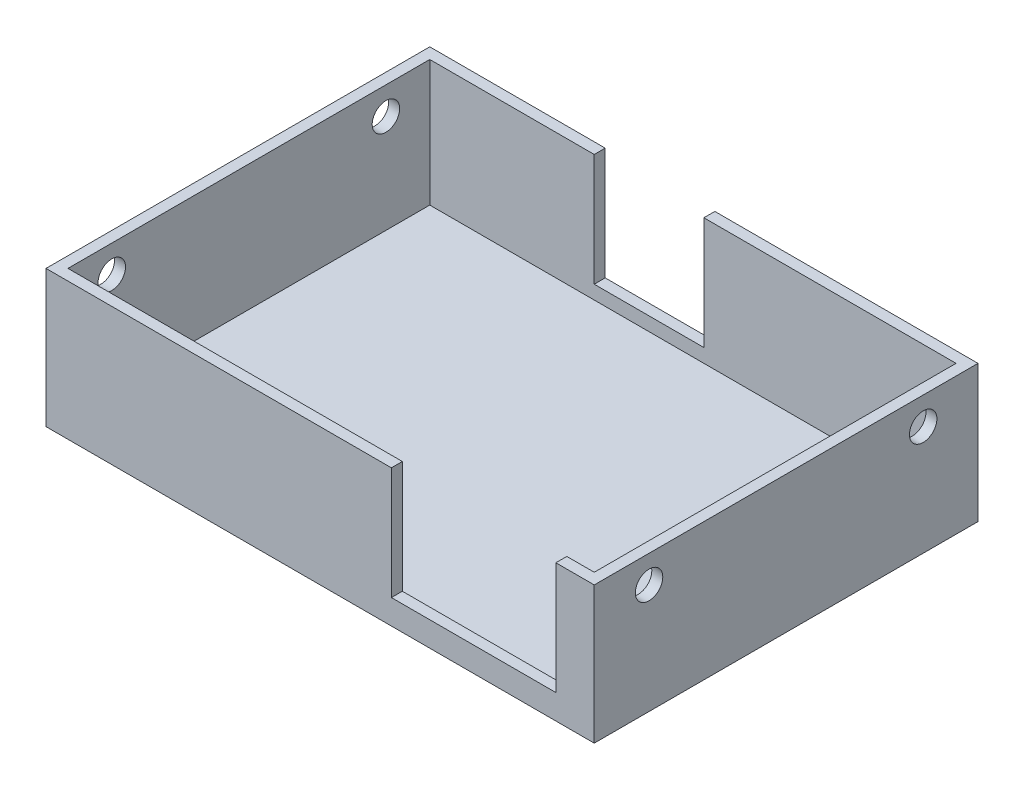
ISO-10303-21;
HEADER;
FILE_DESCRIPTION(('STEP AP214'),'2;1');
FILE_NAME('part.step','',(''),(''),'','','');
FILE_SCHEMA(('AUTOMOTIVE_DESIGN { 1 0 10303 214 1 1 1 1 }'));
ENDSEC;
DATA;
#1=APPLICATION_CONTEXT('core data for automotive mechanical design processes');
#2=APPLICATION_PROTOCOL_DEFINITION('international standard','automotive_design',2000,#1);
#3=PRODUCT_CONTEXT('',#1,'mechanical');
#4=PRODUCT('Part','Part','',(#3));
#5=PRODUCT_RELATED_PRODUCT_CATEGORY('part','',(#4));
#6=PRODUCT_DEFINITION_FORMATION('','',#4);
#7=PRODUCT_DEFINITION_CONTEXT('part definition',#1,'design');
#8=PRODUCT_DEFINITION('design','',#6,#7);
#9=PRODUCT_DEFINITION_SHAPE('','',#8);
#10=(LENGTH_UNIT() NAMED_UNIT(*) SI_UNIT(.MILLI.,.METRE.));
#11=(NAMED_UNIT(*) PLANE_ANGLE_UNIT() SI_UNIT($,.RADIAN.));
#12=(NAMED_UNIT(*) SI_UNIT($,.STERADIAN.) SOLID_ANGLE_UNIT());
#13=UNCERTAINTY_MEASURE_WITH_UNIT(LENGTH_MEASURE(1.E-05),#10,'distance_accuracy_value','');
#14=(GEOMETRIC_REPRESENTATION_CONTEXT(3) GLOBAL_UNCERTAINTY_ASSIGNED_CONTEXT((#13)) GLOBAL_UNIT_ASSIGNED_CONTEXT((#10,
#11,#12)) REPRESENTATION_CONTEXT('',''));
#15=CARTESIAN_POINT('',(0.,0.,0.));
#16=DIRECTION('',(0.,0.,1.));
#17=DIRECTION('',(1.,0.,0.));
#18=AXIS2_PLACEMENT_3D('',#15,#16,#17);
#19=CARTESIAN_POINT('',(0.,31.75,0.));
#20=DIRECTION('',(0.,-1.,0.));
#21=DIRECTION('',(0.,0.,-1.));
#22=AXIS2_PLACEMENT_3D('',#19,#20,#21);
#23=PLANE('',#22);
#24=DIRECTION('',(-1.,0.,0.));
#25=VECTOR('',#24,1.);
#26=CARTESIAN_POINT('',(0.,31.75,-88.9));
#27=LINE('',#26,#25);
#28=CARTESIAN_POINT('',(127.,31.75,-88.9));
#29=VERTEX_POINT('',#28);
#30=CARTESIAN_POINT('',(66.0399999999999,31.75,-88.9));
#31=VERTEX_POINT('',#30);
#32=EDGE_CURVE('E296',#29,#31,#27,.T.);
#33=ORIENTED_EDGE('',*,*,#32,.T.);
#34=DIRECTION('',(0.,0.,-1.));
#35=VECTOR('',#34,1.);
#36=CARTESIAN_POINT('',(66.0399999999999,31.75,-57.15));
#37=LINE('',#36,#35);
#38=CARTESIAN_POINT('',(66.0399999999999,31.75,-86.36));
#39=VERTEX_POINT('',#38);
#40=EDGE_CURVE('E170',#39,#31,#37,.T.);
#41=ORIENTED_EDGE('',*,*,#40,.F.);
#42=DIRECTION('',(-1.,0.,0.));
#43=VECTOR('',#42,1.);
#44=CARTESIAN_POINT('',(0.,31.75,-86.36));
#45=LINE('',#44,#43);
#46=CARTESIAN_POINT('',(124.46,31.75,-86.36));
#47=VERTEX_POINT('',#46);
#48=EDGE_CURVE('E252',#47,#39,#45,.T.);
#49=ORIENTED_EDGE('',*,*,#48,.F.);
#50=DIRECTION('',(0.,0.,-1.));
#51=VECTOR('',#50,1.);
#52=CARTESIAN_POINT('',(124.46,31.75,0.));
#53=LINE('',#52,#51);
#54=CARTESIAN_POINT('',(124.46,31.75,-2.54));
#55=VERTEX_POINT('',#54);
#56=EDGE_CURVE('E274',#55,#47,#53,.T.);
#57=ORIENTED_EDGE('',*,*,#56,.F.);
#58=DIRECTION('',(1.,0.,0.));
#59=VECTOR('',#58,1.);
#60=CARTESIAN_POINT('',(0.,31.75,-2.54));
#61=LINE('',#60,#59);
#62=CARTESIAN_POINT('',(118.11,31.75,-2.54));
#63=VERTEX_POINT('',#62);
#64=EDGE_CURVE('E269',#63,#55,#61,.T.);
#65=ORIENTED_EDGE('',*,*,#64,.F.);
#66=DIRECTION('',(0.,0.,1.));
#67=VECTOR('',#66,1.);
#68=CARTESIAN_POINT('',(118.11,31.75,-31.75));
#69=LINE('',#68,#67);
#70=CARTESIAN_POINT('',(118.11,31.75,0.));
#71=VERTEX_POINT('',#70);
#72=EDGE_CURVE('E209',#63,#71,#69,.T.);
#73=ORIENTED_EDGE('',*,*,#72,.T.);
#74=DIRECTION('',(1.,0.,0.));
#75=VECTOR('',#74,1.);
#76=CARTESIAN_POINT('',(0.,31.75,0.));
#77=LINE('',#76,#75);
#78=CARTESIAN_POINT('',(127.,31.75,0.));
#79=VERTEX_POINT('',#78);
#80=EDGE_CURVE('E286',#71,#79,#77,.T.);
#81=ORIENTED_EDGE('',*,*,#80,.T.);
#82=DIRECTION('',(0.,0.,-1.));
#83=VECTOR('',#82,1.);
#84=CARTESIAN_POINT('',(127.,31.75,0.));
#85=LINE('',#84,#83);
#86=EDGE_CURVE('E292',#79,#29,#85,.T.);
#87=ORIENTED_EDGE('',*,*,#86,.T.);
#88=EDGE_LOOP('',(#33,#41,#49,#57,#65,#73,#81,#87));
#89=FACE_BOUND('',#88,.T.);
#90=ADVANCED_FACE('F42',(#89),#23,.F.);
#91=CARTESIAN_POINT('',(40.6399999999999,31.75,-86.36));
#92=VERTEX_POINT('',#91);
#93=CARTESIAN_POINT('',(2.53999999999995,31.75,-86.36));
#94=VERTEX_POINT('',#93);
#95=EDGE_CURVE('E278',#92,#94,#45,.T.);
#96=ORIENTED_EDGE('',*,*,#95,.F.);
#97=DIRECTION('',(0.,0.,-1.));
#98=VECTOR('',#97,1.);
#99=CARTESIAN_POINT('',(40.6399999999999,31.75,-57.15));
#100=LINE('',#99,#98);
#101=CARTESIAN_POINT('',(40.6399999999999,31.75,-88.9));
#102=VERTEX_POINT('',#101);
#103=EDGE_CURVE('E189',#92,#102,#100,.T.);
#104=ORIENTED_EDGE('',*,*,#103,.T.);
#105=CARTESIAN_POINT('',(0.,31.75,-88.9));
#106=VERTEX_POINT('',#105);
#107=EDGE_CURVE('E295',#102,#106,#27,.T.);
#108=ORIENTED_EDGE('',*,*,#107,.T.);
#109=DIRECTION('',(0.,0.,1.));
#110=VECTOR('',#109,1.);
#111=CARTESIAN_POINT('',(0.,31.75,0.));
#112=LINE('',#111,#110);
#113=CARTESIAN_POINT('',(0.,31.75,0.));
#114=VERTEX_POINT('',#113);
#115=EDGE_CURVE('E282',#106,#114,#112,.T.);
#116=ORIENTED_EDGE('',*,*,#115,.T.);
#117=CARTESIAN_POINT('',(80.01,31.75,0.));
#118=VERTEX_POINT('',#117);
#119=EDGE_CURVE('E288',#114,#118,#77,.T.);
#120=ORIENTED_EDGE('',*,*,#119,.T.);
#121=DIRECTION('',(0.,0.,1.));
#122=VECTOR('',#121,1.);
#123=CARTESIAN_POINT('',(80.01,31.75,-31.75));
#124=LINE('',#123,#122);
#125=CARTESIAN_POINT('',(80.01,31.75,-2.54));
#126=VERTEX_POINT('',#125);
#127=EDGE_CURVE('E205',#126,#118,#124,.T.);
#128=ORIENTED_EDGE('',*,*,#127,.F.);
#129=CARTESIAN_POINT('',(2.54,31.75,-2.54));
#130=VERTEX_POINT('',#129);
#131=EDGE_CURVE('E270',#130,#126,#61,.T.);
#132=ORIENTED_EDGE('',*,*,#131,.F.);
#133=DIRECTION('',(0.,0.,1.));
#134=VECTOR('',#133,1.);
#135=CARTESIAN_POINT('',(2.54,31.75,0.));
#136=LINE('',#135,#134);
#137=EDGE_CURVE('E266',#94,#130,#136,.T.);
#138=ORIENTED_EDGE('',*,*,#137,.F.);
#139=EDGE_LOOP('',(#96,#104,#108,#116,#120,#128,#132,#138));
#140=FACE_BOUND('',#139,.T.);
#141=ADVANCED_FACE('F434',(#140),#23,.F.);
#142=CARTESIAN_POINT('',(0.,31.75,0.));
#143=DIRECTION('',(1.,0.,0.));
#144=DIRECTION('',(0.,0.,-1.));
#145=AXIS2_PLACEMENT_3D('',#142,#143,#144);
#146=PLANE('',#145);
#147=CARTESIAN_POINT('',(0.,25.4,-12.6999999999999));
#148=DIRECTION('',(1.,0.,0.));
#149=DIRECTION('',(0.,0.,-1.));
#150=AXIS2_PLACEMENT_3D('',#147,#148,#149);
#151=CIRCLE('',#150,3.175);
#152=CARTESIAN_POINT('',(0.,25.4,-15.8749999999999));
#153=VERTEX_POINT('',#152);
#154=EDGE_CURVE('E217',#153,#153,#151,.T.);
#155=ORIENTED_EDGE('',*,*,#154,.T.);
#156=EDGE_LOOP('',(#155));
#157=FACE_BOUND('',#156,.T.);
#158=CARTESIAN_POINT('',(0.,25.4,-76.1999999999999));
#159=DIRECTION('',(1.,0.,0.));
#160=DIRECTION('',(0.,0.,-1.));
#161=AXIS2_PLACEMENT_3D('',#158,#159,#160);
#162=CIRCLE('',#161,3.175);
#163=CARTESIAN_POINT('',(0.,25.4,-79.3749999999999));
#164=VERTEX_POINT('',#163);
#165=EDGE_CURVE('E208',#164,#164,#162,.T.);
#166=ORIENTED_EDGE('',*,*,#165,.T.);
#167=EDGE_LOOP('',(#166));
#168=FACE_BOUND('',#167,.T.);
#169=DIRECTION('',(0.,0.,1.));
#170=VECTOR('',#169,1.);
#171=CARTESIAN_POINT('',(0.,0.,0.));
#172=LINE('',#171,#170);
#173=CARTESIAN_POINT('',(0.,0.,-88.9));
#174=VERTEX_POINT('',#173);
#175=CARTESIAN_POINT('',(0.,0.,0.));
#176=VERTEX_POINT('',#175);
#177=EDGE_CURVE('E245',#174,#176,#172,.T.);
#178=ORIENTED_EDGE('',*,*,#177,.T.);
#179=DIRECTION('',(0.,-1.,0.));
#180=VECTOR('',#179,1.);
#181=CARTESIAN_POINT('',(0.,31.75,0.));
#182=LINE('',#181,#180);
#183=EDGE_CURVE('E322',#114,#176,#182,.T.);
#184=ORIENTED_EDGE('',*,*,#183,.F.);
#185=ORIENTED_EDGE('',*,*,#115,.F.);
#186=DIRECTION('',(0.,-1.,0.));
#187=VECTOR('',#186,1.);
#188=CARTESIAN_POINT('',(0.,31.75,-88.9));
#189=LINE('',#188,#187);
#190=EDGE_CURVE('E299',#106,#174,#189,.T.);
#191=ORIENTED_EDGE('',*,*,#190,.T.);
#192=EDGE_LOOP('',(#178,#184,#185,#191));
#193=FACE_BOUND('',#192,.T.);
#194=ADVANCED_FACE('F44',(#157,#168,#193),#146,.F.);
#195=CARTESIAN_POINT('',(0.,31.75,0.));
#196=DIRECTION('',(0.,0.,-1.));
#197=DIRECTION('',(-1.,0.,0.));
#198=AXIS2_PLACEMENT_3D('',#195,#196,#197);
#199=PLANE('',#198);
#200=DIRECTION('',(1.,0.,0.));
#201=VECTOR('',#200,1.);
#202=CARTESIAN_POINT('',(80.01,5.715,0.));
#203=LINE('',#202,#201);
#204=CARTESIAN_POINT('',(80.01,5.715,0.));
#205=VERTEX_POINT('',#204);
#206=CARTESIAN_POINT('',(118.11,5.715,0.));
#207=VERTEX_POINT('',#206);
#208=EDGE_CURVE('E198',#205,#207,#203,.T.);
#209=ORIENTED_EDGE('',*,*,#208,.F.);
#210=DIRECTION('',(0.,-1.,0.));
#211=VECTOR('',#210,1.);
#212=CARTESIAN_POINT('',(80.01,31.75,0.));
#213=LINE('',#212,#211);
#214=EDGE_CURVE('E188',#118,#205,#213,.T.);
#215=ORIENTED_EDGE('',*,*,#214,.F.);
#216=ORIENTED_EDGE('',*,*,#119,.F.);
#217=ORIENTED_EDGE('',*,*,#183,.T.);
#218=DIRECTION('',(1.,0.,0.));
#219=VECTOR('',#218,1.);
#220=CARTESIAN_POINT('',(0.,0.,0.));
#221=LINE('',#220,#219);
#222=CARTESIAN_POINT('',(127.,0.,0.));
#223=VERTEX_POINT('',#222);
#224=EDGE_CURVE('E303',#176,#223,#221,.T.);
#225=ORIENTED_EDGE('',*,*,#224,.T.);
#226=DIRECTION('',(0.,-1.,0.));
#227=VECTOR('',#226,1.);
#228=CARTESIAN_POINT('',(127.,31.75,0.));
#229=LINE('',#228,#227);
#230=EDGE_CURVE('E318',#79,#223,#229,.T.);
#231=ORIENTED_EDGE('',*,*,#230,.F.);
#232=ORIENTED_EDGE('',*,*,#80,.F.);
#233=DIRECTION('',(0.,1.,0.));
#234=VECTOR('',#233,1.);
#235=CARTESIAN_POINT('',(118.11,31.75,0.));
#236=LINE('',#235,#234);
#237=EDGE_CURVE('E201',#207,#71,#236,.T.);
#238=ORIENTED_EDGE('',*,*,#237,.F.);
#239=EDGE_LOOP('',(#209,#215,#216,#217,#225,#231,#232,#238));
#240=FACE_BOUND('',#239,.T.);
#241=ADVANCED_FACE('F454',(#240),#199,.F.);
#242=CARTESIAN_POINT('',(127.,31.75,0.));
#243=DIRECTION('',(-1.,0.,0.));
#244=DIRECTION('',(0.,0.,1.));
#245=AXIS2_PLACEMENT_3D('',#242,#243,#244);
#246=PLANE('',#245);
#247=CARTESIAN_POINT('',(127.,25.4,-12.7));
#248=DIRECTION('',(1.,0.,0.));
#249=DIRECTION('',(0.,0.,-1.));
#250=AXIS2_PLACEMENT_3D('',#247,#248,#249);
#251=CIRCLE('',#250,3.175);
#252=CARTESIAN_POINT('',(127.,25.4,-15.875));
#253=VERTEX_POINT('',#252);
#254=EDGE_CURVE('E225',#253,#253,#251,.T.);
#255=ORIENTED_EDGE('',*,*,#254,.F.);
#256=EDGE_LOOP('',(#255));
#257=FACE_BOUND('',#256,.T.);
#258=CARTESIAN_POINT('',(127.,25.4,-76.2));
#259=DIRECTION('',(1.,0.,0.));
#260=DIRECTION('',(0.,0.,-1.));
#261=AXIS2_PLACEMENT_3D('',#258,#259,#260);
#262=CIRCLE('',#261,3.175);
#263=CARTESIAN_POINT('',(127.,25.4,-79.375));
#264=VERTEX_POINT('',#263);
#265=EDGE_CURVE('E230',#264,#264,#262,.T.);
#266=ORIENTED_EDGE('',*,*,#265,.F.);
#267=EDGE_LOOP('',(#266));
#268=FACE_BOUND('',#267,.T.);
#269=DIRECTION('',(0.,0.,-1.));
#270=VECTOR('',#269,1.);
#271=CARTESIAN_POINT('',(127.,0.,0.));
#272=LINE('',#271,#270);
#273=CARTESIAN_POINT('',(127.,0.,-88.9));
#274=VERTEX_POINT('',#273);
#275=EDGE_CURVE('E306',#223,#274,#272,.T.);
#276=ORIENTED_EDGE('',*,*,#275,.T.);
#277=DIRECTION('',(0.,-1.,0.));
#278=VECTOR('',#277,1.);
#279=CARTESIAN_POINT('',(127.,31.75,-88.9));
#280=LINE('',#279,#278);
#281=EDGE_CURVE('E314',#29,#274,#280,.T.);
#282=ORIENTED_EDGE('',*,*,#281,.F.);
#283=ORIENTED_EDGE('',*,*,#86,.F.);
#284=ORIENTED_EDGE('',*,*,#230,.T.);
#285=EDGE_LOOP('',(#276,#282,#283,#284));
#286=FACE_BOUND('',#285,.T.);
#287=ADVANCED_FACE('F460',(#257,#268,#286),#246,.F.);
#288=CARTESIAN_POINT('',(0.,31.75,-88.9));
#289=DIRECTION('',(0.,0.,1.));
#290=DIRECTION('',(1.,0.,0.));
#291=AXIS2_PLACEMENT_3D('',#288,#289,#290);
#292=PLANE('',#291);
#293=DIRECTION('',(-1.,0.,0.));
#294=VECTOR('',#293,1.);
#295=CARTESIAN_POINT('',(66.0399999999999,5.715,-88.9));
#296=LINE('',#295,#294);
#297=CARTESIAN_POINT('',(66.0399999999999,5.715,-88.9));
#298=VERTEX_POINT('',#297);
#299=CARTESIAN_POINT('',(40.6399999999999,5.715,-88.9));
#300=VERTEX_POINT('',#299);
#301=EDGE_CURVE('E157',#298,#300,#296,.T.);
#302=ORIENTED_EDGE('',*,*,#301,.F.);
#303=DIRECTION('',(0.,-1.,0.));
#304=VECTOR('',#303,1.);
#305=CARTESIAN_POINT('',(66.0399999999999,31.75,-88.9));
#306=LINE('',#305,#304);
#307=EDGE_CURVE('E167',#31,#298,#306,.T.);
#308=ORIENTED_EDGE('',*,*,#307,.F.);
#309=ORIENTED_EDGE('',*,*,#32,.F.);
#310=ORIENTED_EDGE('',*,*,#281,.T.);
#311=DIRECTION('',(-1.,0.,0.));
#312=VECTOR('',#311,1.);
#313=CARTESIAN_POINT('',(0.,0.,-88.9));
#314=LINE('',#313,#312);
#315=EDGE_CURVE('E287',#274,#174,#314,.T.);
#316=ORIENTED_EDGE('',*,*,#315,.T.);
#317=ORIENTED_EDGE('',*,*,#190,.F.);
#318=ORIENTED_EDGE('',*,*,#107,.F.);
#319=DIRECTION('',(0.,1.,0.));
#320=VECTOR('',#319,1.);
#321=CARTESIAN_POINT('',(40.6399999999999,31.75,-88.9));
#322=LINE('',#321,#320);
#323=EDGE_CURVE('E164',#300,#102,#322,.T.);
#324=ORIENTED_EDGE('',*,*,#323,.F.);
#325=EDGE_LOOP('',(#302,#308,#309,#310,#316,#317,#318,#324));
#326=FACE_BOUND('',#325,.T.);
#327=ADVANCED_FACE('F176',(#326),#292,.F.);
#328=CARTESIAN_POINT('',(0.,0.,0.));
#329=DIRECTION('',(0.,-1.,0.));
#330=DIRECTION('',(0.,0.,-1.));
#331=AXIS2_PLACEMENT_3D('',#328,#329,#330);
#332=PLANE('',#331);
#333=ORIENTED_EDGE('',*,*,#177,.F.);
#334=ORIENTED_EDGE('',*,*,#315,.F.);
#335=ORIENTED_EDGE('',*,*,#275,.F.);
#336=ORIENTED_EDGE('',*,*,#224,.F.);
#337=EDGE_LOOP('',(#333,#334,#335,#336));
#338=FACE_BOUND('',#337,.T.);
#339=ADVANCED_FACE('F367',(#338),#332,.T.);
#340=CARTESIAN_POINT('',(2.54,31.75,0.));
#341=DIRECTION('',(1.,0.,0.));
#342=DIRECTION('',(0.,0.,-1.));
#343=AXIS2_PLACEMENT_3D('',#340,#341,#342);
#344=PLANE('',#343);
#345=CARTESIAN_POINT('',(2.53999999999999,25.4,-12.6999999999999));
#346=DIRECTION('',(1.,0.,0.));
#347=DIRECTION('',(0.,0.,-1.));
#348=AXIS2_PLACEMENT_3D('',#345,#346,#347);
#349=CIRCLE('',#348,3.175);
#350=CARTESIAN_POINT('',(2.53999999999999,25.4,-15.8749999999999));
#351=VERTEX_POINT('',#350);
#352=EDGE_CURVE('E234',#351,#351,#349,.F.);
#353=ORIENTED_EDGE('',*,*,#352,.T.);
#354=EDGE_LOOP('',(#353));
#355=FACE_BOUND('',#354,.T.);
#356=CARTESIAN_POINT('',(2.53999999999995,25.4,-76.1999999999999));
#357=DIRECTION('',(1.,0.,0.));
#358=DIRECTION('',(0.,0.,-1.));
#359=AXIS2_PLACEMENT_3D('',#356,#357,#358);
#360=CIRCLE('',#359,3.175);
#361=CARTESIAN_POINT('',(2.53999999999995,25.4,-79.3749999999999));
#362=VERTEX_POINT('',#361);
#363=EDGE_CURVE('E221',#362,#362,#360,.F.);
#364=ORIENTED_EDGE('',*,*,#363,.T.);
#365=EDGE_LOOP('',(#364));
#366=FACE_BOUND('',#365,.T.);
#367=DIRECTION('',(0.,0.,1.));
#368=VECTOR('',#367,1.);
#369=CARTESIAN_POINT('',(2.54,2.54,0.));
#370=LINE('',#369,#368);
#371=CARTESIAN_POINT('',(2.53999999999995,2.54,-86.36));
#372=VERTEX_POINT('',#371);
#373=CARTESIAN_POINT('',(2.54,2.54,-2.54));
#374=VERTEX_POINT('',#373);
#375=EDGE_CURVE('E235',#372,#374,#370,.T.);
#376=ORIENTED_EDGE('',*,*,#375,.F.);
#377=DIRECTION('',(0.,-1.,0.));
#378=VECTOR('',#377,1.);
#379=CARTESIAN_POINT('',(2.53999999999995,31.75,-86.36));
#380=LINE('',#379,#378);
#381=EDGE_CURVE('E247',#94,#372,#380,.T.);
#382=ORIENTED_EDGE('',*,*,#381,.F.);
#383=ORIENTED_EDGE('',*,*,#137,.T.);
#384=DIRECTION('',(0.,-1.,0.));
#385=VECTOR('',#384,1.);
#386=CARTESIAN_POINT('',(2.54,31.75,-2.54));
#387=LINE('',#386,#385);
#388=EDGE_CURVE('E241',#130,#374,#387,.T.);
#389=ORIENTED_EDGE('',*,*,#388,.T.);
#390=EDGE_LOOP('',(#376,#382,#383,#389));
#391=FACE_BOUND('',#390,.T.);
#392=ADVANCED_FACE('F431',(#355,#366,#391),#344,.T.);
#393=CARTESIAN_POINT('',(0.,31.75,-2.54));
#394=DIRECTION('',(0.,0.,-1.));
#395=DIRECTION('',(-1.,0.,0.));
#396=AXIS2_PLACEMENT_3D('',#393,#394,#395);
#397=PLANE('',#396);
#398=DIRECTION('',(0.,1.,0.));
#399=VECTOR('',#398,1.);
#400=CARTESIAN_POINT('',(80.01,31.75,-2.54));
#401=LINE('',#400,#399);
#402=CARTESIAN_POINT('',(80.01,5.715,-2.54));
#403=VERTEX_POINT('',#402);
#404=EDGE_CURVE('E344',#403,#126,#401,.T.);
#405=ORIENTED_EDGE('',*,*,#404,.F.);
#406=DIRECTION('',(-1.,0.,0.));
#407=VECTOR('',#406,1.);
#408=CARTESIAN_POINT('',(0.,5.71499999999999,-2.54));
#409=LINE('',#408,#407);
#410=CARTESIAN_POINT('',(118.11,5.715,-2.54));
#411=VERTEX_POINT('',#410);
#412=EDGE_CURVE('E326',#411,#403,#409,.T.);
#413=ORIENTED_EDGE('',*,*,#412,.F.);
#414=DIRECTION('',(0.,-1.,0.));
#415=VECTOR('',#414,1.);
#416=CARTESIAN_POINT('',(118.11,31.75,-2.54));
#417=LINE('',#416,#415);
#418=EDGE_CURVE('E341',#63,#411,#417,.T.);
#419=ORIENTED_EDGE('',*,*,#418,.F.);
#420=ORIENTED_EDGE('',*,*,#64,.T.);
#421=DIRECTION('',(0.,-1.,0.));
#422=VECTOR('',#421,1.);
#423=CARTESIAN_POINT('',(124.46,31.75,-2.54));
#424=LINE('',#423,#422);
#425=CARTESIAN_POINT('',(124.46,2.54,-2.54));
#426=VERTEX_POINT('',#425);
#427=EDGE_CURVE('E246',#55,#426,#424,.T.);
#428=ORIENTED_EDGE('',*,*,#427,.T.);
#429=DIRECTION('',(1.,0.,0.));
#430=VECTOR('',#429,1.);
#431=CARTESIAN_POINT('',(0.,2.54,-2.54));
#432=LINE('',#431,#430);
#433=EDGE_CURVE('E239',#374,#426,#432,.T.);
#434=ORIENTED_EDGE('',*,*,#433,.F.);
#435=ORIENTED_EDGE('',*,*,#388,.F.);
#436=ORIENTED_EDGE('',*,*,#131,.T.);
#437=EDGE_LOOP('',(#405,#413,#419,#420,#428,#434,#435,#436));
#438=FACE_BOUND('',#437,.T.);
#439=ADVANCED_FACE('F438',(#438),#397,.T.);
#440=CARTESIAN_POINT('',(124.46,31.75,0.));
#441=DIRECTION('',(-1.,0.,0.));
#442=DIRECTION('',(0.,0.,1.));
#443=AXIS2_PLACEMENT_3D('',#440,#441,#442);
#444=PLANE('',#443);
#445=CARTESIAN_POINT('',(124.46,25.4,-12.7));
#446=DIRECTION('',(-1.,0.,0.));
#447=DIRECTION('',(0.,0.,1.));
#448=AXIS2_PLACEMENT_3D('',#445,#446,#447);
#449=CIRCLE('',#448,3.175);
#450=CARTESIAN_POINT('',(124.46,25.4,-9.525));
#451=VERTEX_POINT('',#450);
#452=EDGE_CURVE('E240',#451,#451,#449,.T.);
#453=ORIENTED_EDGE('',*,*,#452,.F.);
#454=EDGE_LOOP('',(#453));
#455=FACE_BOUND('',#454,.T.);
#456=CARTESIAN_POINT('',(124.46,25.4,-76.2));
#457=DIRECTION('',(-1.,0.,0.));
#458=DIRECTION('',(0.,0.,1.));
#459=AXIS2_PLACEMENT_3D('',#456,#457,#458);
#460=CIRCLE('',#459,3.175);
#461=CARTESIAN_POINT('',(124.46,25.4,-73.025));
#462=VERTEX_POINT('',#461);
#463=EDGE_CURVE('E229',#462,#462,#460,.T.);
#464=ORIENTED_EDGE('',*,*,#463,.F.);
#465=EDGE_LOOP('',(#464));
#466=FACE_BOUND('',#465,.T.);
#467=DIRECTION('',(0.,0.,-1.));
#468=VECTOR('',#467,1.);
#469=CARTESIAN_POINT('',(124.46,2.54,0.));
#470=LINE('',#469,#468);
#471=CARTESIAN_POINT('',(124.46,2.54,-86.36));
#472=VERTEX_POINT('',#471);
#473=EDGE_CURVE('E254',#426,#472,#470,.T.);
#474=ORIENTED_EDGE('',*,*,#473,.F.);
#475=ORIENTED_EDGE('',*,*,#427,.F.);
#476=ORIENTED_EDGE('',*,*,#56,.T.);
#477=DIRECTION('',(0.,-1.,0.));
#478=VECTOR('',#477,1.);
#479=CARTESIAN_POINT('',(124.46,31.75,-86.36));
#480=LINE('',#479,#478);
#481=EDGE_CURVE('E251',#47,#472,#480,.T.);
#482=ORIENTED_EDGE('',*,*,#481,.T.);
#483=EDGE_LOOP('',(#474,#475,#476,#482));
#484=FACE_BOUND('',#483,.T.);
#485=ADVANCED_FACE('F445',(#455,#466,#484),#444,.T.);
#486=CARTESIAN_POINT('',(0.,31.75,-86.36));
#487=DIRECTION('',(0.,0.,1.));
#488=DIRECTION('',(1.,0.,0.));
#489=AXIS2_PLACEMENT_3D('',#486,#487,#488);
#490=PLANE('',#489);
#491=DIRECTION('',(0.,1.,0.));
#492=VECTOR('',#491,1.);
#493=CARTESIAN_POINT('',(66.0399999999999,31.75,-86.36));
#494=LINE('',#493,#492);
#495=CARTESIAN_POINT('',(66.0399999999999,5.715,-86.36));
#496=VERTEX_POINT('',#495);
#497=EDGE_CURVE('E11',#496,#39,#494,.T.);
#498=ORIENTED_EDGE('',*,*,#497,.F.);
#499=DIRECTION('',(1.,0.,0.));
#500=VECTOR('',#499,1.);
#501=CARTESIAN_POINT('',(0.,5.715,-86.36));
#502=LINE('',#501,#500);
#503=CARTESIAN_POINT('',(40.6399999999999,5.715,-86.36));
#504=VERTEX_POINT('',#503);
#505=EDGE_CURVE('E160',#504,#496,#502,.T.);
#506=ORIENTED_EDGE('',*,*,#505,.F.);
#507=DIRECTION('',(0.,-1.,0.));
#508=VECTOR('',#507,1.);
#509=CARTESIAN_POINT('',(40.6399999999999,31.75,-86.36));
#510=LINE('',#509,#508);
#511=EDGE_CURVE('E51',#92,#504,#510,.T.);
#512=ORIENTED_EDGE('',*,*,#511,.F.);
#513=ORIENTED_EDGE('',*,*,#95,.T.);
#514=ORIENTED_EDGE('',*,*,#381,.T.);
#515=DIRECTION('',(-1.,0.,0.));
#516=VECTOR('',#515,1.);
#517=CARTESIAN_POINT('',(0.,2.54,-86.36));
#518=LINE('',#517,#516);
#519=EDGE_CURVE('E260',#472,#372,#518,.T.);
#520=ORIENTED_EDGE('',*,*,#519,.F.);
#521=ORIENTED_EDGE('',*,*,#481,.F.);
#522=ORIENTED_EDGE('',*,*,#48,.T.);
#523=EDGE_LOOP('',(#498,#506,#512,#513,#514,#520,#521,#522));
#524=FACE_BOUND('',#523,.T.);
#525=ADVANCED_FACE('F355',(#524),#490,.T.);
#526=CARTESIAN_POINT('',(0.,2.54,0.));
#527=DIRECTION('',(0.,-1.,0.));
#528=DIRECTION('',(0.,0.,-1.));
#529=AXIS2_PLACEMENT_3D('',#526,#527,#528);
#530=PLANE('',#529);
#531=ORIENTED_EDGE('',*,*,#375,.T.);
#532=ORIENTED_EDGE('',*,*,#433,.T.);
#533=ORIENTED_EDGE('',*,*,#473,.T.);
#534=ORIENTED_EDGE('',*,*,#519,.T.);
#535=EDGE_LOOP('',(#531,#532,#533,#534));
#536=FACE_BOUND('',#535,.T.);
#537=ADVANCED_FACE('F441',(#536),#530,.F.);
#538=CARTESIAN_POINT('',(95.2499999999999,25.4,-76.2));
#539=DIRECTION('',(1.,0.,0.));
#540=DIRECTION('',(0.,0.,-1.));
#541=AXIS2_PLACEMENT_3D('',#538,#539,#540);
#542=CYLINDRICAL_SURFACE('',#541,3.175);
#543=ORIENTED_EDGE('',*,*,#463,.T.);
#544=EDGE_LOOP('',(#543));
#545=FACE_BOUND('',#544,.T.);
#546=ORIENTED_EDGE('',*,*,#265,.T.);
#547=EDGE_LOOP('',(#546));
#548=FACE_BOUND('',#547,.T.);
#549=ADVANCED_FACE('F491',(#545,#548),#542,.F.);
#550=CARTESIAN_POINT('',(95.25,25.4,-12.7));
#551=DIRECTION('',(1.,0.,0.));
#552=DIRECTION('',(0.,0.,-1.));
#553=AXIS2_PLACEMENT_3D('',#550,#551,#552);
#554=CYLINDRICAL_SURFACE('',#553,3.175);
#555=ORIENTED_EDGE('',*,*,#452,.T.);
#556=EDGE_LOOP('',(#555));
#557=FACE_BOUND('',#556,.T.);
#558=ORIENTED_EDGE('',*,*,#254,.T.);
#559=EDGE_LOOP('',(#558));
#560=FACE_BOUND('',#559,.T.);
#561=ADVANCED_FACE('F503',(#557,#560),#554,.F.);
#562=CARTESIAN_POINT('',(31.75,25.4,-76.1999999999999));
#563=DIRECTION('',(-1.,0.,0.));
#564=DIRECTION('',(0.,0.,1.));
#565=AXIS2_PLACEMENT_3D('',#562,#563,#564);
#566=CYLINDRICAL_SURFACE('',#565,3.175);
#567=ORIENTED_EDGE('',*,*,#363,.F.);
#568=EDGE_LOOP('',(#567));
#569=FACE_BOUND('',#568,.T.);
#570=ORIENTED_EDGE('',*,*,#165,.F.);
#571=EDGE_LOOP('',(#570));
#572=FACE_BOUND('',#571,.T.);
#573=ADVANCED_FACE('F508',(#569,#572),#566,.F.);
#574=CARTESIAN_POINT('',(31.75,25.4,-12.6999999999999));
#575=DIRECTION('',(-1.,0.,0.));
#576=DIRECTION('',(0.,0.,1.));
#577=AXIS2_PLACEMENT_3D('',#574,#575,#576);
#578=CYLINDRICAL_SURFACE('',#577,3.175);
#579=ORIENTED_EDGE('',*,*,#352,.F.);
#580=EDGE_LOOP('',(#579));
#581=FACE_BOUND('',#580,.T.);
#582=ORIENTED_EDGE('',*,*,#154,.F.);
#583=EDGE_LOOP('',(#582));
#584=FACE_BOUND('',#583,.T.);
#585=ADVANCED_FACE('F517',(#581,#584),#578,.F.);
#586=CARTESIAN_POINT('',(80.01,31.75,-31.75));
#587=DIRECTION('',(-1.,0.,0.));
#588=DIRECTION('',(0.,0.,1.));
#589=AXIS2_PLACEMENT_3D('',#586,#587,#588);
#590=PLANE('',#589);
#591=ORIENTED_EDGE('',*,*,#404,.T.);
#592=ORIENTED_EDGE('',*,*,#127,.T.);
#593=ORIENTED_EDGE('',*,*,#214,.T.);
#594=DIRECTION('',(0.,0.,1.));
#595=VECTOR('',#594,1.);
#596=CARTESIAN_POINT('',(80.01,5.715,-31.75));
#597=LINE('',#596,#595);
#598=EDGE_CURVE('E204',#403,#205,#597,.T.);
#599=ORIENTED_EDGE('',*,*,#598,.F.);
#600=EDGE_LOOP('',(#591,#592,#593,#599));
#601=FACE_BOUND('',#600,.T.);
#602=ADVANCED_FACE('F524',(#601),#590,.F.);
#603=CARTESIAN_POINT('',(118.11,31.75,-31.75));
#604=DIRECTION('',(1.,0.,0.));
#605=DIRECTION('',(0.,0.,-1.));
#606=AXIS2_PLACEMENT_3D('',#603,#604,#605);
#607=PLANE('',#606);
#608=ORIENTED_EDGE('',*,*,#418,.T.);
#609=DIRECTION('',(0.,0.,1.));
#610=VECTOR('',#609,1.);
#611=CARTESIAN_POINT('',(118.11,5.715,-31.75));
#612=LINE('',#611,#610);
#613=EDGE_CURVE('E66',#411,#207,#612,.T.);
#614=ORIENTED_EDGE('',*,*,#613,.T.);
#615=ORIENTED_EDGE('',*,*,#237,.T.);
#616=ORIENTED_EDGE('',*,*,#72,.F.);
#617=EDGE_LOOP('',(#608,#614,#615,#616));
#618=FACE_BOUND('',#617,.T.);
#619=ADVANCED_FACE('F450',(#618),#607,.F.);
#620=CARTESIAN_POINT('',(80.01,5.715,-31.75));
#621=DIRECTION('',(0.,-1.,0.));
#622=DIRECTION('',(1.,0.,0.));
#623=AXIS2_PLACEMENT_3D('',#620,#621,#622);
#624=PLANE('',#623);
#625=ORIENTED_EDGE('',*,*,#412,.T.);
#626=ORIENTED_EDGE('',*,*,#598,.T.);
#627=ORIENTED_EDGE('',*,*,#208,.T.);
#628=ORIENTED_EDGE('',*,*,#613,.F.);
#629=EDGE_LOOP('',(#625,#626,#627,#628));
#630=FACE_BOUND('',#629,.T.);
#631=ADVANCED_FACE('F529',(#630),#624,.F.);
#632=CARTESIAN_POINT('',(66.0399999999999,31.75,-57.15));
#633=DIRECTION('',(1.,0.,0.));
#634=DIRECTION('',(0.,0.,-1.));
#635=AXIS2_PLACEMENT_3D('',#632,#633,#634);
#636=PLANE('',#635);
#637=ORIENTED_EDGE('',*,*,#497,.T.);
#638=ORIENTED_EDGE('',*,*,#40,.T.);
#639=ORIENTED_EDGE('',*,*,#307,.T.);
#640=DIRECTION('',(0.,0.,-1.));
#641=VECTOR('',#640,1.);
#642=CARTESIAN_POINT('',(66.0399999999999,5.715,-57.15));
#643=LINE('',#642,#641);
#644=EDGE_CURVE('E153',#496,#298,#643,.T.);
#645=ORIENTED_EDGE('',*,*,#644,.F.);
#646=EDGE_LOOP('',(#637,#638,#639,#645));
#647=FACE_BOUND('',#646,.T.);
#648=ADVANCED_FACE('F168',(#647),#636,.F.);
#649=CARTESIAN_POINT('',(40.6399999999999,31.75,-57.15));
#650=DIRECTION('',(-1.,0.,0.));
#651=DIRECTION('',(0.,0.,1.));
#652=AXIS2_PLACEMENT_3D('',#649,#650,#651);
#653=PLANE('',#652);
#654=ORIENTED_EDGE('',*,*,#511,.T.);
#655=DIRECTION('',(0.,0.,-1.));
#656=VECTOR('',#655,1.);
#657=CARTESIAN_POINT('',(40.6399999999999,5.715,-57.15));
#658=LINE('',#657,#656);
#659=EDGE_CURVE('E58',#504,#300,#658,.T.);
#660=ORIENTED_EDGE('',*,*,#659,.T.);
#661=ORIENTED_EDGE('',*,*,#323,.T.);
#662=ORIENTED_EDGE('',*,*,#103,.F.);
#663=EDGE_LOOP('',(#654,#660,#661,#662));
#664=FACE_BOUND('',#663,.T.);
#665=ADVANCED_FACE('F352',(#664),#653,.F.);
#666=CARTESIAN_POINT('',(66.0399999999999,5.715,-57.15));
#667=DIRECTION('',(0.,-1.,0.));
#668=DIRECTION('',(0.,0.,-1.));
#669=AXIS2_PLACEMENT_3D('',#666,#667,#668);
#670=PLANE('',#669);
#671=ORIENTED_EDGE('',*,*,#505,.T.);
#672=ORIENTED_EDGE('',*,*,#644,.T.);
#673=ORIENTED_EDGE('',*,*,#301,.T.);
#674=ORIENTED_EDGE('',*,*,#659,.F.);
#675=EDGE_LOOP('',(#671,#672,#673,#674));
#676=FACE_BOUND('',#675,.T.);
#677=ADVANCED_FACE('F155',(#676),#670,.F.);
#678=CLOSED_SHELL('',(#90,#141,#194,#241,#287,#327,#339,#392,#439,#485,#525,#537,#549,#561,#573,
#585,#602,#619,#631,#648,#665,#677));
#679=MANIFOLD_SOLID_BREP('B2',#678);
#680=ADVANCED_BREP_SHAPE_REPRESENTATION('',(#18,#679),#14);
#681=SHAPE_DEFINITION_REPRESENTATION(#9,#680);
ENDSEC;
END-ISO-10303-21;
